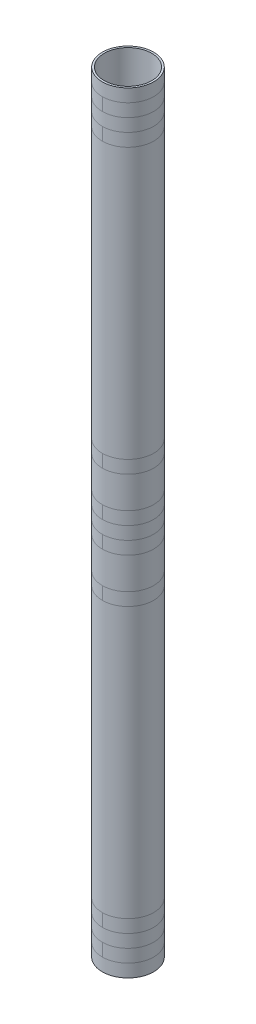
ISO-10303-21;
HEADER;
FILE_DESCRIPTION(('STEP AP214'),'2;1');
FILE_NAME('part.step','',(''),(''),'','','');
FILE_SCHEMA(('AUTOMOTIVE_DESIGN { 1 0 10303 214 1 1 1 1 }'));
ENDSEC;
DATA;
#1=APPLICATION_CONTEXT('core data for automotive mechanical design processes');
#2=APPLICATION_PROTOCOL_DEFINITION('international standard','automotive_design',2000,#1);
#3=PRODUCT_CONTEXT('',#1,'mechanical');
#4=PRODUCT('Part','Part','',(#3));
#5=PRODUCT_RELATED_PRODUCT_CATEGORY('part','',(#4));
#6=PRODUCT_DEFINITION_FORMATION('','',#4);
#7=PRODUCT_DEFINITION_CONTEXT('part definition',#1,'design');
#8=PRODUCT_DEFINITION('design','',#6,#7);
#9=PRODUCT_DEFINITION_SHAPE('','',#8);
#10=(LENGTH_UNIT() NAMED_UNIT(*) SI_UNIT(.MILLI.,.METRE.));
#11=(NAMED_UNIT(*) PLANE_ANGLE_UNIT() SI_UNIT($,.RADIAN.));
#12=(NAMED_UNIT(*) SI_UNIT($,.STERADIAN.) SOLID_ANGLE_UNIT());
#13=UNCERTAINTY_MEASURE_WITH_UNIT(LENGTH_MEASURE(1.E-05),#10,'distance_accuracy_value','');
#14=(GEOMETRIC_REPRESENTATION_CONTEXT(3) GLOBAL_UNCERTAINTY_ASSIGNED_CONTEXT((#13)) GLOBAL_UNIT_ASSIGNED_CONTEXT((#10,
#11,#12)) REPRESENTATION_CONTEXT('',''));
#15=CARTESIAN_POINT('',(0.,0.,0.));
#16=DIRECTION('',(0.,0.,1.));
#17=DIRECTION('',(1.,0.,0.));
#18=AXIS2_PLACEMENT_3D('',#15,#16,#17);
#19=CARTESIAN_POINT('',(0.,600.,0.));
#20=DIRECTION('',(0.,-1.,0.));
#21=DIRECTION('',(0.,0.,-1.));
#22=AXIS2_PLACEMENT_3D('',#19,#20,#21);
#23=CYLINDRICAL_SURFACE('',#22,20.);
#24=DIRECTION('',(0.,-1.,0.));
#25=VECTOR('',#24,1.);
#26=CARTESIAN_POINT('',(0.,600.,-20.));
#27=LINE('',#26,#25);
#28=CARTESIAN_POINT('',(0.,260.42,-20.));
#29=VERTEX_POINT('',#28);
#30=CARTESIAN_POINT('',(0.,250.42,-20.));
#31=VERTEX_POINT('',#30);
#32=EDGE_CURVE('E11',#29,#31,#27,.T.);
#33=ORIENTED_EDGE('',*,*,#32,.F.);
#34=CARTESIAN_POINT('',(0.,260.42,0.));
#35=DIRECTION('',(0.,-1.,0.));
#36=DIRECTION('',(0.,0.,-1.));
#37=AXIS2_PLACEMENT_3D('',#34,#35,#36);
#38=CIRCLE('',#37,20.);
#39=CARTESIAN_POINT('',(20.,260.42,0.));
#40=VERTEX_POINT('',#39);
#41=EDGE_CURVE('E323',#29,#40,#38,.T.);
#42=ORIENTED_EDGE('',*,*,#41,.T.);
#43=CARTESIAN_POINT('',(0.,260.42,0.));
#44=DIRECTION('',(0.,-1.,0.));
#45=DIRECTION('',(0.,0.,-1.));
#46=AXIS2_PLACEMENT_3D('',#43,#44,#45);
#47=CIRCLE('',#46,20.);
#48=CARTESIAN_POINT('',(0.,260.42,20.));
#49=VERTEX_POINT('',#48);
#50=EDGE_CURVE('E327',#40,#49,#47,.T.);
#51=ORIENTED_EDGE('',*,*,#50,.T.);
#52=DIRECTION('',(0.,-1.,0.));
#53=VECTOR('',#52,1.);
#54=CARTESIAN_POINT('',(0.,600.,20.));
#55=LINE('',#54,#53);
#56=CARTESIAN_POINT('',(0.,250.42,20.));
#57=VERTEX_POINT('',#56);
#58=EDGE_CURVE('E328',#49,#57,#55,.T.);
#59=ORIENTED_EDGE('',*,*,#58,.T.);
#60=CARTESIAN_POINT('',(0.,250.42,0.));
#61=DIRECTION('',(0.,1.,0.));
#62=DIRECTION('',(0.,0.,1.));
#63=AXIS2_PLACEMENT_3D('',#60,#61,#62);
#64=CIRCLE('',#63,20.);
#65=CARTESIAN_POINT('',(20.,250.42,0.));
#66=VERTEX_POINT('',#65);
#67=EDGE_CURVE('E50',#57,#66,#64,.T.);
#68=ORIENTED_EDGE('',*,*,#67,.T.);
#69=CARTESIAN_POINT('',(0.,250.42,0.));
#70=DIRECTION('',(0.,1.,0.));
#71=DIRECTION('',(0.,0.,1.));
#72=AXIS2_PLACEMENT_3D('',#69,#70,#71);
#73=CIRCLE('',#72,20.);
#74=EDGE_CURVE('E336',#66,#31,#73,.T.);
#75=ORIENTED_EDGE('',*,*,#74,.T.);
#76=EDGE_LOOP('',(#33,#42,#51,#59,#68,#75));
#77=FACE_BOUND('',#76,.T.);
#78=ADVANCED_FACE('F41',(#77),#23,.T.);
#79=CARTESIAN_POINT('',(0.,40.,0.));
#80=DIRECTION('',(0.,-1.,0.));
#81=DIRECTION('',(0.,0.,-1.));
#82=AXIS2_PLACEMENT_3D('',#79,#80,#81);
#83=CIRCLE('',#82,20.);
#84=CARTESIAN_POINT('',(0.,40.,-20.));
#85=VERTEX_POINT('',#84);
#86=CARTESIAN_POINT('',(0.,40.,20.0000000000001));
#87=VERTEX_POINT('',#86);
#88=EDGE_CURVE('E250',#85,#87,#83,.T.);
#89=ORIENTED_EDGE('',*,*,#88,.F.);
#90=EDGE_CURVE('E255',#87,#85,#83,.T.);
#91=ORIENTED_EDGE('',*,*,#90,.F.);
#92=EDGE_LOOP('',(#89,#91));
#93=FACE_BOUND('',#92,.T.);
#94=ORIENTED_EDGE('',*,*,#67,.F.);
#95=CARTESIAN_POINT('',(-20.,250.42,0.));
#96=VERTEX_POINT('',#95);
#97=EDGE_CURVE('E331',#96,#57,#64,.T.);
#98=ORIENTED_EDGE('',*,*,#97,.F.);
#99=EDGE_CURVE('E334',#31,#96,#73,.T.);
#100=ORIENTED_EDGE('',*,*,#99,.F.);
#101=ORIENTED_EDGE('',*,*,#74,.F.);
#102=EDGE_LOOP('',(#94,#98,#100,#101));
#103=FACE_BOUND('',#102,.T.);
#104=ADVANCED_FACE('F368',(#93,#103),#23,.T.);
#105=CARTESIAN_POINT('',(0.,285.,0.));
#106=DIRECTION('',(0.,1.,0.));
#107=DIRECTION('',(0.,0.,1.));
#108=AXIS2_PLACEMENT_3D('',#105,#106,#107);
#109=CIRCLE('',#108,20.);
#110=CARTESIAN_POINT('',(0.,285.,20.));
#111=VERTEX_POINT('',#110);
#112=CARTESIAN_POINT('',(0.,285.,-20.));
#113=VERTEX_POINT('',#112);
#114=EDGE_CURVE('E266',#111,#113,#109,.T.);
#115=ORIENTED_EDGE('',*,*,#114,.F.);
#116=EDGE_CURVE('E267',#113,#111,#109,.T.);
#117=ORIENTED_EDGE('',*,*,#116,.F.);
#118=EDGE_LOOP('',(#115,#117));
#119=FACE_BOUND('',#118,.T.);
#120=ORIENTED_EDGE('',*,*,#50,.F.);
#121=ORIENTED_EDGE('',*,*,#41,.F.);
#122=CARTESIAN_POINT('',(-20.,260.42,0.));
#123=VERTEX_POINT('',#122);
#124=EDGE_CURVE('E320',#123,#29,#38,.T.);
#125=ORIENTED_EDGE('',*,*,#124,.F.);
#126=EDGE_CURVE('E324',#49,#123,#47,.T.);
#127=ORIENTED_EDGE('',*,*,#126,.F.);
#128=EDGE_LOOP('',(#120,#121,#125,#127));
#129=FACE_BOUND('',#128,.T.);
#130=ADVANCED_FACE('F365',(#119,#129),#23,.T.);
#131=DIRECTION('',(0.,-1.,0.));
#132=VECTOR('',#131,1.);
#133=CARTESIAN_POINT('',(0.,600.,-20.));
#134=LINE('',#133,#132);
#135=CARTESIAN_POINT('',(0.,349.58,-20.));
#136=VERTEX_POINT('',#135);
#137=CARTESIAN_POINT('',(0.,339.58,-20.));
#138=VERTEX_POINT('',#137);
#139=EDGE_CURVE('E317',#136,#138,#134,.T.);
#140=ORIENTED_EDGE('',*,*,#139,.F.);
#141=CARTESIAN_POINT('',(0.,349.58,0.));
#142=DIRECTION('',(0.,-1.,0.));
#143=DIRECTION('',(0.,0.,-1.));
#144=AXIS2_PLACEMENT_3D('',#141,#142,#143);
#145=CIRCLE('',#144,20.);
#146=CARTESIAN_POINT('',(20.,349.58,0.));
#147=VERTEX_POINT('',#146);
#148=EDGE_CURVE('E299',#136,#147,#145,.T.);
#149=ORIENTED_EDGE('',*,*,#148,.T.);
#150=CARTESIAN_POINT('',(0.,349.58,0.));
#151=DIRECTION('',(0.,-1.,0.));
#152=DIRECTION('',(0.,0.,-1.));
#153=AXIS2_PLACEMENT_3D('',#150,#151,#152);
#154=CIRCLE('',#153,20.);
#155=CARTESIAN_POINT('',(0.,349.58,20.));
#156=VERTEX_POINT('',#155);
#157=EDGE_CURVE('E303',#147,#156,#154,.T.);
#158=ORIENTED_EDGE('',*,*,#157,.T.);
#159=DIRECTION('',(0.,-1.,0.));
#160=VECTOR('',#159,1.);
#161=CARTESIAN_POINT('',(0.,600.,20.));
#162=LINE('',#161,#160);
#163=CARTESIAN_POINT('',(0.,339.58,20.));
#164=VERTEX_POINT('',#163);
#165=EDGE_CURVE('E304',#156,#164,#162,.T.);
#166=ORIENTED_EDGE('',*,*,#165,.T.);
#167=CARTESIAN_POINT('',(0.,339.58,0.));
#168=DIRECTION('',(0.,1.,0.));
#169=DIRECTION('',(0.,0.,1.));
#170=AXIS2_PLACEMENT_3D('',#167,#168,#169);
#171=CIRCLE('',#170,20.);
#172=CARTESIAN_POINT('',(20.,339.58,0.));
#173=VERTEX_POINT('',#172);
#174=EDGE_CURVE('E313',#164,#173,#171,.T.);
#175=ORIENTED_EDGE('',*,*,#174,.T.);
#176=CARTESIAN_POINT('',(0.,339.58,0.));
#177=DIRECTION('',(0.,1.,0.));
#178=DIRECTION('',(0.,0.,1.));
#179=AXIS2_PLACEMENT_3D('',#176,#177,#178);
#180=CIRCLE('',#179,20.);
#181=EDGE_CURVE('E316',#173,#138,#180,.T.);
#182=ORIENTED_EDGE('',*,*,#181,.T.);
#183=EDGE_LOOP('',(#140,#149,#158,#166,#175,#182));
#184=FACE_BOUND('',#183,.T.);
#185=ADVANCED_FACE('F375',(#184),#23,.T.);
#186=CARTESIAN_POINT('',(0.,315.,0.));
#187=DIRECTION('',(0.,-1.,0.));
#188=DIRECTION('',(0.,0.,-1.));
#189=AXIS2_PLACEMENT_3D('',#186,#187,#188);
#190=CIRCLE('',#189,20.);
#191=CARTESIAN_POINT('',(0.,315.,-20.));
#192=VERTEX_POINT('',#191);
#193=CARTESIAN_POINT('',(0.,315.,20.));
#194=VERTEX_POINT('',#193);
#195=EDGE_CURVE('E292',#192,#194,#190,.T.);
#196=ORIENTED_EDGE('',*,*,#195,.F.);
#197=EDGE_CURVE('E265',#194,#192,#190,.T.);
#198=ORIENTED_EDGE('',*,*,#197,.F.);
#199=EDGE_LOOP('',(#196,#198));
#200=FACE_BOUND('',#199,.T.);
#201=ORIENTED_EDGE('',*,*,#174,.F.);
#202=CARTESIAN_POINT('',(-20.,339.58,0.));
#203=VERTEX_POINT('',#202);
#204=EDGE_CURVE('E308',#203,#164,#171,.T.);
#205=ORIENTED_EDGE('',*,*,#204,.F.);
#206=EDGE_CURVE('E312',#138,#203,#180,.T.);
#207=ORIENTED_EDGE('',*,*,#206,.F.);
#208=ORIENTED_EDGE('',*,*,#181,.F.);
#209=EDGE_LOOP('',(#201,#205,#207,#208));
#210=FACE_BOUND('',#209,.T.);
#211=ADVANCED_FACE('F411',(#200,#210),#23,.T.);
#212=CARTESIAN_POINT('',(0.,560.,0.));
#213=DIRECTION('',(0.,1.,0.));
#214=DIRECTION('',(0.,0.,1.));
#215=AXIS2_PLACEMENT_3D('',#212,#213,#214);
#216=CIRCLE('',#215,20.);
#217=CARTESIAN_POINT('',(0.,560.,20.));
#218=VERTEX_POINT('',#217);
#219=CARTESIAN_POINT('',(0.,560.,-20.));
#220=VERTEX_POINT('',#219);
#221=EDGE_CURVE('E232',#218,#220,#216,.T.);
#222=ORIENTED_EDGE('',*,*,#221,.F.);
#223=EDGE_CURVE('E233',#220,#218,#216,.T.);
#224=ORIENTED_EDGE('',*,*,#223,.F.);
#225=EDGE_LOOP('',(#222,#224));
#226=FACE_BOUND('',#225,.T.);
#227=ORIENTED_EDGE('',*,*,#157,.F.);
#228=ORIENTED_EDGE('',*,*,#148,.F.);
#229=CARTESIAN_POINT('',(-20.,349.58,0.));
#230=VERTEX_POINT('',#229);
#231=EDGE_CURVE('E282',#230,#136,#145,.T.);
#232=ORIENTED_EDGE('',*,*,#231,.F.);
#233=EDGE_CURVE('E300',#156,#230,#154,.T.);
#234=ORIENTED_EDGE('',*,*,#233,.F.);
#235=EDGE_LOOP('',(#227,#228,#232,#234));
#236=FACE_BOUND('',#235,.T.);
#237=ADVANCED_FACE('F470',(#226,#236),#23,.T.);
#238=DIRECTION('',(0.,-1.,0.));
#239=VECTOR('',#238,1.);
#240=CARTESIAN_POINT('',(0.,600.,19.9999999999999));
#241=LINE('',#240,#239);
#242=CARTESIAN_POINT('',(0.,305.,20.));
#243=VERTEX_POINT('',#242);
#244=EDGE_CURVE('E279',#194,#243,#241,.T.);
#245=ORIENTED_EDGE('',*,*,#244,.F.);
#246=ORIENTED_EDGE('',*,*,#197,.T.);
#247=DIRECTION('',(0.,-1.,0.));
#248=VECTOR('',#247,1.);
#249=CARTESIAN_POINT('',(0.,600.,-20.));
#250=LINE('',#249,#248);
#251=CARTESIAN_POINT('',(0.,305.,-20.));
#252=VERTEX_POINT('',#251);
#253=EDGE_CURVE('E288',#192,#252,#250,.T.);
#254=ORIENTED_EDGE('',*,*,#253,.T.);
#255=CARTESIAN_POINT('',(0.,305.,0.));
#256=DIRECTION('',(0.,1.,0.));
#257=DIRECTION('',(0.,0.,1.));
#258=AXIS2_PLACEMENT_3D('',#255,#256,#257);
#259=CIRCLE('',#258,20.);
#260=EDGE_CURVE('E284',#252,#243,#259,.T.);
#261=ORIENTED_EDGE('',*,*,#260,.T.);
#262=EDGE_LOOP('',(#245,#246,#254,#261));
#263=FACE_BOUND('',#262,.T.);
#264=ADVANCED_FACE('F414',(#263),#23,.T.);
#265=CARTESIAN_POINT('',(0.,295.,0.));
#266=DIRECTION('',(0.,-1.,0.));
#267=DIRECTION('',(0.,0.,-1.));
#268=AXIS2_PLACEMENT_3D('',#265,#266,#267);
#269=CIRCLE('',#268,20.);
#270=CARTESIAN_POINT('',(0.,295.,-20.));
#271=VERTEX_POINT('',#270);
#272=CARTESIAN_POINT('',(0.,295.,20.));
#273=VERTEX_POINT('',#272);
#274=EDGE_CURVE('E275',#271,#273,#269,.T.);
#275=ORIENTED_EDGE('',*,*,#274,.F.);
#276=EDGE_CURVE('E254',#273,#271,#269,.T.);
#277=ORIENTED_EDGE('',*,*,#276,.F.);
#278=EDGE_LOOP('',(#275,#277));
#279=FACE_BOUND('',#278,.T.);
#280=EDGE_CURVE('E283',#243,#252,#259,.T.);
#281=ORIENTED_EDGE('',*,*,#280,.F.);
#282=ORIENTED_EDGE('',*,*,#260,.F.);
#283=EDGE_LOOP('',(#281,#282));
#284=FACE_BOUND('',#283,.T.);
#285=ADVANCED_FACE('F417',(#279,#284),#23,.T.);
#286=ORIENTED_EDGE('',*,*,#231,.T.);
#287=ORIENTED_EDGE('',*,*,#139,.T.);
#288=ORIENTED_EDGE('',*,*,#206,.T.);
#289=ORIENTED_EDGE('',*,*,#204,.T.);
#290=ORIENTED_EDGE('',*,*,#165,.F.);
#291=ORIENTED_EDGE('',*,*,#233,.T.);
#292=EDGE_LOOP('',(#286,#287,#288,#289,#290,#291));
#293=FACE_BOUND('',#292,.T.);
#294=ADVANCED_FACE('F466',(#293),#23,.T.);
#295=DIRECTION('',(0.,-1.,0.));
#296=VECTOR('',#295,1.);
#297=CARTESIAN_POINT('',(0.,600.,19.9999999999999));
#298=LINE('',#297,#296);
#299=EDGE_CURVE('E262',#273,#111,#298,.T.);
#300=ORIENTED_EDGE('',*,*,#299,.F.);
#301=ORIENTED_EDGE('',*,*,#276,.T.);
#302=DIRECTION('',(0.,-1.,0.));
#303=VECTOR('',#302,1.);
#304=CARTESIAN_POINT('',(0.,600.,-20.));
#305=LINE('',#304,#303);
#306=EDGE_CURVE('E271',#271,#113,#305,.T.);
#307=ORIENTED_EDGE('',*,*,#306,.T.);
#308=ORIENTED_EDGE('',*,*,#116,.T.);
#309=EDGE_LOOP('',(#300,#301,#307,#308));
#310=FACE_BOUND('',#309,.T.);
#311=ADVANCED_FACE('F404',(#310),#23,.T.);
#312=ORIENTED_EDGE('',*,*,#124,.T.);
#313=ORIENTED_EDGE('',*,*,#32,.T.);
#314=ORIENTED_EDGE('',*,*,#99,.T.);
#315=ORIENTED_EDGE('',*,*,#97,.T.);
#316=ORIENTED_EDGE('',*,*,#58,.F.);
#317=ORIENTED_EDGE('',*,*,#126,.T.);
#318=EDGE_LOOP('',(#312,#313,#314,#315,#316,#317));
#319=FACE_BOUND('',#318,.T.);
#320=ADVANCED_FACE('F366',(#319),#23,.T.);
#321=ORIENTED_EDGE('',*,*,#195,.T.);
#322=ORIENTED_EDGE('',*,*,#244,.T.);
#323=ORIENTED_EDGE('',*,*,#280,.T.);
#324=ORIENTED_EDGE('',*,*,#253,.F.);
#325=EDGE_LOOP('',(#321,#322,#323,#324));
#326=FACE_BOUND('',#325,.T.);
#327=ADVANCED_FACE('F396',(#326),#23,.T.);
#328=DIRECTION('',(0.,-1.,0.));
#329=VECTOR('',#328,1.);
#330=CARTESIAN_POINT('',(0.,600.,-20.));
#331=LINE('',#330,#329);
#332=CARTESIAN_POINT('',(0.,30.,-20.));
#333=VERTEX_POINT('',#332);
#334=EDGE_CURVE('E251',#85,#333,#331,.T.);
#335=ORIENTED_EDGE('',*,*,#334,.F.);
#336=ORIENTED_EDGE('',*,*,#88,.T.);
#337=DIRECTION('',(0.,-1.,0.));
#338=VECTOR('',#337,1.);
#339=CARTESIAN_POINT('',(0.,600.,20.0000000000001));
#340=LINE('',#339,#338);
#341=CARTESIAN_POINT('',(0.,30.,20.0000000000001));
#342=VERTEX_POINT('',#341);
#343=EDGE_CURVE('E231',#87,#342,#340,.T.);
#344=ORIENTED_EDGE('',*,*,#343,.T.);
#345=CARTESIAN_POINT('',(0.,30.,0.));
#346=DIRECTION('',(0.,1.,0.));
#347=DIRECTION('',(0.,0.,1.));
#348=AXIS2_PLACEMENT_3D('',#345,#346,#347);
#349=CIRCLE('',#348,20.);
#350=EDGE_CURVE('E249',#342,#333,#349,.T.);
#351=ORIENTED_EDGE('',*,*,#350,.T.);
#352=EDGE_LOOP('',(#335,#336,#344,#351));
#353=FACE_BOUND('',#352,.T.);
#354=ADVANCED_FACE('F386',(#353),#23,.T.);
#355=CARTESIAN_POINT('',(0.,20.,0.));
#356=DIRECTION('',(0.,-1.,0.));
#357=DIRECTION('',(0.,0.,-1.));
#358=AXIS2_PLACEMENT_3D('',#355,#356,#357);
#359=CIRCLE('',#358,20.);
#360=CARTESIAN_POINT('',(0.,20.,-20.));
#361=VERTEX_POINT('',#360);
#362=CARTESIAN_POINT('',(0.,20.,20.));
#363=VERTEX_POINT('',#362);
#364=EDGE_CURVE('E191',#361,#363,#359,.T.);
#365=ORIENTED_EDGE('',*,*,#364,.F.);
#366=EDGE_CURVE('E181',#363,#361,#359,.T.);
#367=ORIENTED_EDGE('',*,*,#366,.F.);
#368=EDGE_LOOP('',(#365,#367));
#369=FACE_BOUND('',#368,.T.);
#370=ORIENTED_EDGE('',*,*,#350,.F.);
#371=EDGE_CURVE('E245',#333,#342,#349,.T.);
#372=ORIENTED_EDGE('',*,*,#371,.F.);
#373=EDGE_LOOP('',(#370,#372));
#374=FACE_BOUND('',#373,.T.);
#375=ADVANCED_FACE('F196',(#369,#374),#23,.T.);
#376=ORIENTED_EDGE('',*,*,#274,.T.);
#377=ORIENTED_EDGE('',*,*,#299,.T.);
#378=ORIENTED_EDGE('',*,*,#114,.T.);
#379=ORIENTED_EDGE('',*,*,#306,.F.);
#380=EDGE_LOOP('',(#376,#377,#378,#379));
#381=FACE_BOUND('',#380,.T.);
#382=ADVANCED_FACE('F389',(#381),#23,.T.);
#383=DIRECTION('',(0.,-1.,0.));
#384=VECTOR('',#383,1.);
#385=CARTESIAN_POINT('',(0.,600.,20.));
#386=LINE('',#385,#384);
#387=CARTESIAN_POINT('',(0.,570.,20.));
#388=VERTEX_POINT('',#387);
#389=EDGE_CURVE('E228',#388,#218,#386,.T.);
#390=ORIENTED_EDGE('',*,*,#389,.F.);
#391=CARTESIAN_POINT('',(0.,570.,0.));
#392=DIRECTION('',(0.,-1.,0.));
#393=DIRECTION('',(0.,0.,-1.));
#394=AXIS2_PLACEMENT_3D('',#391,#392,#393);
#395=CIRCLE('',#394,20.);
#396=CARTESIAN_POINT('',(0.,570.,-20.));
#397=VERTEX_POINT('',#396);
#398=EDGE_CURVE('E227',#388,#397,#395,.T.);
#399=ORIENTED_EDGE('',*,*,#398,.T.);
#400=DIRECTION('',(0.,-1.,0.));
#401=VECTOR('',#400,1.);
#402=CARTESIAN_POINT('',(0.,600.,-20.));
#403=LINE('',#402,#401);
#404=EDGE_CURVE('E237',#397,#220,#403,.T.);
#405=ORIENTED_EDGE('',*,*,#404,.T.);
#406=ORIENTED_EDGE('',*,*,#223,.T.);
#407=EDGE_LOOP('',(#390,#399,#405,#406));
#408=FACE_BOUND('',#407,.T.);
#409=ADVANCED_FACE('F394',(#408),#23,.T.);
#410=ORIENTED_EDGE('',*,*,#90,.T.);
#411=ORIENTED_EDGE('',*,*,#334,.T.);
#412=ORIENTED_EDGE('',*,*,#371,.T.);
#413=ORIENTED_EDGE('',*,*,#343,.F.);
#414=EDGE_LOOP('',(#410,#411,#412,#413));
#415=FACE_BOUND('',#414,.T.);
#416=ADVANCED_FACE('F383',(#415),#23,.T.);
#417=CARTESIAN_POINT('',(0.,580.,0.));
#418=DIRECTION('',(0.,1.,0.));
#419=DIRECTION('',(0.,0.,1.));
#420=AXIS2_PLACEMENT_3D('',#417,#418,#419);
#421=CIRCLE('',#420,20.);
#422=CARTESIAN_POINT('',(0.,580.,20.));
#423=VERTEX_POINT('',#422);
#424=CARTESIAN_POINT('',(0.,580.,-20.));
#425=VERTEX_POINT('',#424);
#426=EDGE_CURVE('E223',#423,#425,#421,.T.);
#427=ORIENTED_EDGE('',*,*,#426,.F.);
#428=EDGE_CURVE('E219',#425,#423,#421,.T.);
#429=ORIENTED_EDGE('',*,*,#428,.F.);
#430=EDGE_LOOP('',(#427,#429));
#431=FACE_BOUND('',#430,.T.);
#432=EDGE_CURVE('E241',#397,#388,#395,.T.);
#433=ORIENTED_EDGE('',*,*,#432,.F.);
#434=ORIENTED_EDGE('',*,*,#398,.F.);
#435=EDGE_LOOP('',(#433,#434));
#436=FACE_BOUND('',#435,.T.);
#437=ADVANCED_FACE('F487',(#431,#436),#23,.T.);
#438=DIRECTION('',(0.,-1.,0.));
#439=VECTOR('',#438,1.);
#440=CARTESIAN_POINT('',(0.,600.,20.));
#441=LINE('',#440,#439);
#442=CARTESIAN_POINT('',(0.,590.,20.));
#443=VERTEX_POINT('',#442);
#444=EDGE_CURVE('E224',#443,#423,#441,.T.);
#445=ORIENTED_EDGE('',*,*,#444,.F.);
#446=CARTESIAN_POINT('',(0.,590.,0.));
#447=DIRECTION('',(0.,-1.,0.));
#448=DIRECTION('',(0.,0.,-1.));
#449=AXIS2_PLACEMENT_3D('',#446,#447,#448);
#450=CIRCLE('',#449,20.);
#451=CARTESIAN_POINT('',(0.,590.,-20.));
#452=VERTEX_POINT('',#451);
#453=EDGE_CURVE('E187',#443,#452,#450,.T.);
#454=ORIENTED_EDGE('',*,*,#453,.T.);
#455=DIRECTION('',(0.,-1.,0.));
#456=VECTOR('',#455,1.);
#457=CARTESIAN_POINT('',(0.,600.,-20.));
#458=LINE('',#457,#456);
#459=EDGE_CURVE('E215',#452,#425,#458,.T.);
#460=ORIENTED_EDGE('',*,*,#459,.T.);
#461=ORIENTED_EDGE('',*,*,#428,.T.);
#462=EDGE_LOOP('',(#445,#454,#460,#461));
#463=FACE_BOUND('',#462,.T.);
#464=ADVANCED_FACE('F643',(#463),#23,.T.);
#465=ORIENTED_EDGE('',*,*,#432,.T.);
#466=ORIENTED_EDGE('',*,*,#389,.T.);
#467=ORIENTED_EDGE('',*,*,#221,.T.);
#468=ORIENTED_EDGE('',*,*,#404,.F.);
#469=EDGE_LOOP('',(#465,#466,#467,#468));
#470=FACE_BOUND('',#469,.T.);
#471=ADVANCED_FACE('F485',(#470),#23,.T.);
#472=CARTESIAN_POINT('',(0.,600.,0.));
#473=DIRECTION('',(0.,1.,0.));
#474=DIRECTION('',(0.,0.,1.));
#475=AXIS2_PLACEMENT_3D('',#472,#473,#474);
#476=CIRCLE('',#475,20.);
#477=CARTESIAN_POINT('',(0.,600.,20.));
#478=VERTEX_POINT('',#477);
#479=EDGE_CURVE('E199',#478,#478,#476,.T.);
#480=ORIENTED_EDGE('',*,*,#479,.F.);
#481=EDGE_LOOP('',(#480));
#482=FACE_BOUND('',#481,.T.);
#483=EDGE_CURVE('E214',#452,#443,#450,.T.);
#484=ORIENTED_EDGE('',*,*,#483,.F.);
#485=ORIENTED_EDGE('',*,*,#453,.F.);
#486=EDGE_LOOP('',(#484,#485));
#487=FACE_BOUND('',#486,.T.);
#488=ADVANCED_FACE('F626',(#482,#487),#23,.T.);
#489=DIRECTION('',(0.,-1.,0.));
#490=VECTOR('',#489,1.);
#491=CARTESIAN_POINT('',(0.,600.,20.0000000000001));
#492=LINE('',#491,#490);
#493=CARTESIAN_POINT('',(0.,10.,20.));
#494=VERTEX_POINT('',#493);
#495=EDGE_CURVE('E176',#363,#494,#492,.T.);
#496=ORIENTED_EDGE('',*,*,#495,.F.);
#497=ORIENTED_EDGE('',*,*,#366,.T.);
#498=DIRECTION('',(0.,-1.,0.));
#499=VECTOR('',#498,1.);
#500=CARTESIAN_POINT('',(0.,600.,-20.));
#501=LINE('',#500,#499);
#502=CARTESIAN_POINT('',(0.,10.,-20.));
#503=VERTEX_POINT('',#502);
#504=EDGE_CURVE('E192',#361,#503,#501,.T.);
#505=ORIENTED_EDGE('',*,*,#504,.T.);
#506=CARTESIAN_POINT('',(0.,10.,0.));
#507=DIRECTION('',(0.,1.,0.));
#508=DIRECTION('',(0.,0.,1.));
#509=AXIS2_PLACEMENT_3D('',#506,#507,#508);
#510=CIRCLE('',#509,20.);
#511=EDGE_CURVE('E183',#503,#494,#510,.T.);
#512=ORIENTED_EDGE('',*,*,#511,.T.);
#513=EDGE_LOOP('',(#496,#497,#505,#512));
#514=FACE_BOUND('',#513,.T.);
#515=ADVANCED_FACE('F178',(#514),#23,.T.);
#516=CARTESIAN_POINT('',(0.,0.,0.));
#517=DIRECTION('',(0.,1.,0.));
#518=DIRECTION('',(0.,0.,1.));
#519=AXIS2_PLACEMENT_3D('',#516,#517,#518);
#520=CIRCLE('',#519,20.);
#521=CARTESIAN_POINT('',(0.,0.,20.));
#522=VERTEX_POINT('',#521);
#523=EDGE_CURVE('E204',#522,#522,#520,.T.);
#524=ORIENTED_EDGE('',*,*,#523,.T.);
#525=EDGE_LOOP('',(#524));
#526=FACE_BOUND('',#525,.T.);
#527=EDGE_CURVE('E188',#494,#503,#510,.T.);
#528=ORIENTED_EDGE('',*,*,#527,.F.);
#529=ORIENTED_EDGE('',*,*,#511,.F.);
#530=EDGE_LOOP('',(#528,#529));
#531=FACE_BOUND('',#530,.T.);
#532=ADVANCED_FACE('F609',(#526,#531),#23,.T.);
#533=ORIENTED_EDGE('',*,*,#483,.T.);
#534=ORIENTED_EDGE('',*,*,#444,.T.);
#535=ORIENTED_EDGE('',*,*,#426,.T.);
#536=ORIENTED_EDGE('',*,*,#459,.F.);
#537=EDGE_LOOP('',(#533,#534,#535,#536));
#538=FACE_BOUND('',#537,.T.);
#539=ADVANCED_FACE('F600',(#538),#23,.T.);
#540=ORIENTED_EDGE('',*,*,#364,.T.);
#541=ORIENTED_EDGE('',*,*,#495,.T.);
#542=ORIENTED_EDGE('',*,*,#527,.T.);
#543=ORIENTED_EDGE('',*,*,#504,.F.);
#544=EDGE_LOOP('',(#540,#541,#542,#543));
#545=FACE_BOUND('',#544,.T.);
#546=ADVANCED_FACE('F43',(#545),#23,.T.);
#547=CARTESIAN_POINT('',(0.,600.,0.));
#548=DIRECTION('',(0.,1.,0.));
#549=DIRECTION('',(0.,0.,1.));
#550=AXIS2_PLACEMENT_3D('',#547,#548,#549);
#551=PLANE('',#550);
#552=CARTESIAN_POINT('',(0.,600.,0.));
#553=DIRECTION('',(0.,1.,0.));
#554=DIRECTION('',(0.,0.,1.));
#555=AXIS2_PLACEMENT_3D('',#552,#553,#554);
#556=CIRCLE('',#555,18.5);
#557=CARTESIAN_POINT('',(0.,600.,18.5));
#558=VERTEX_POINT('',#557);
#559=EDGE_CURVE('E744',#558,#558,#556,.T.);
#560=ORIENTED_EDGE('',*,*,#559,.F.);
#561=EDGE_LOOP('',(#560));
#562=FACE_BOUND('',#561,.T.);
#563=ORIENTED_EDGE('',*,*,#479,.T.);
#564=EDGE_LOOP('',(#563));
#565=FACE_BOUND('',#564,.T.);
#566=ADVANCED_FACE('F599',(#562,#565),#551,.T.);
#567=CARTESIAN_POINT('',(0.,0.,0.));
#568=DIRECTION('',(0.,1.,0.));
#569=DIRECTION('',(0.,0.,1.));
#570=AXIS2_PLACEMENT_3D('',#567,#568,#569);
#571=PLANE('',#570);
#572=CARTESIAN_POINT('',(0.,0.,0.));
#573=DIRECTION('',(0.,1.,0.));
#574=DIRECTION('',(0.,0.,1.));
#575=AXIS2_PLACEMENT_3D('',#572,#573,#574);
#576=CIRCLE('',#575,18.5);
#577=CARTESIAN_POINT('',(0.,0.,18.5));
#578=VERTEX_POINT('',#577);
#579=EDGE_CURVE('E775',#578,#578,#576,.T.);
#580=ORIENTED_EDGE('',*,*,#579,.T.);
#581=EDGE_LOOP('',(#580));
#582=FACE_BOUND('',#581,.T.);
#583=ORIENTED_EDGE('',*,*,#523,.F.);
#584=EDGE_LOOP('',(#583));
#585=FACE_BOUND('',#584,.T.);
#586=ADVANCED_FACE('F720',(#582,#585),#571,.F.);
#587=CARTESIAN_POINT('',(0.,0.,0.));
#588=DIRECTION('',(0.,1.,0.));
#589=DIRECTION('',(0.,0.,1.));
#590=AXIS2_PLACEMENT_3D('',#587,#588,#589);
#591=CYLINDRICAL_SURFACE('',#590,18.5);
#592=ORIENTED_EDGE('',*,*,#579,.F.);
#593=EDGE_LOOP('',(#592));
#594=FACE_BOUND('',#593,.T.);
#595=ORIENTED_EDGE('',*,*,#559,.T.);
#596=EDGE_LOOP('',(#595));
#597=FACE_BOUND('',#596,.T.);
#598=ADVANCED_FACE('F716',(#594,#597),#591,.F.);
#599=CLOSED_SHELL('',(#78,#104,#130,#185,#211,#237,#264,#285,#294,#311,#320,#327,#354,#375,#382,
#409,#416,#437,#464,#471,#488,#515,#532,#539,#546,#566,#586,#598));
#600=MANIFOLD_SOLID_BREP('B2',#599);
#601=ADVANCED_BREP_SHAPE_REPRESENTATION('',(#18,#600),#14);
#602=SHAPE_DEFINITION_REPRESENTATION(#9,#601);
ENDSEC;
END-ISO-10303-21;
